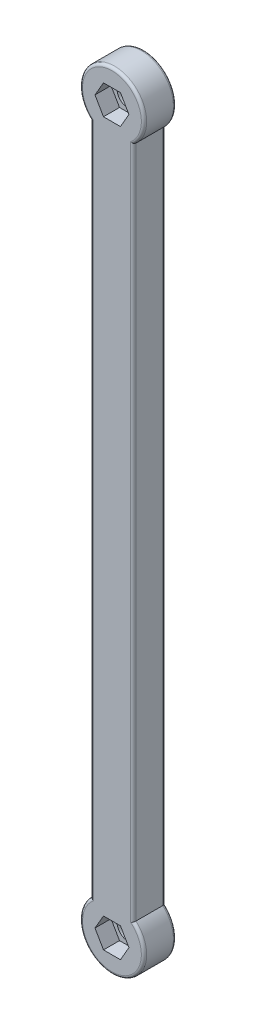
ISO-10303-21;
HEADER;
FILE_DESCRIPTION(('STEP AP214'),'2;1');
FILE_NAME('part.step','',(''),(''),'','','');
FILE_SCHEMA(('AUTOMOTIVE_DESIGN { 1 0 10303 214 1 1 1 1 }'));
ENDSEC;
DATA;
#1=APPLICATION_CONTEXT('core data for automotive mechanical design processes');
#2=APPLICATION_PROTOCOL_DEFINITION('international standard','automotive_design',2000,#1);
#3=PRODUCT_CONTEXT('',#1,'mechanical');
#4=PRODUCT('Part','Part','',(#3));
#5=PRODUCT_RELATED_PRODUCT_CATEGORY('part','',(#4));
#6=PRODUCT_DEFINITION_FORMATION('','',#4);
#7=PRODUCT_DEFINITION_CONTEXT('part definition',#1,'design');
#8=PRODUCT_DEFINITION('design','',#6,#7);
#9=PRODUCT_DEFINITION_SHAPE('','',#8);
#10=(LENGTH_UNIT() NAMED_UNIT(*) SI_UNIT(.MILLI.,.METRE.));
#11=(NAMED_UNIT(*) PLANE_ANGLE_UNIT() SI_UNIT($,.RADIAN.));
#12=(NAMED_UNIT(*) SI_UNIT($,.STERADIAN.) SOLID_ANGLE_UNIT());
#13=UNCERTAINTY_MEASURE_WITH_UNIT(LENGTH_MEASURE(1.E-05),#10,'distance_accuracy_value','');
#14=(GEOMETRIC_REPRESENTATION_CONTEXT(3) GLOBAL_UNCERTAINTY_ASSIGNED_CONTEXT((#13)) GLOBAL_UNIT_ASSIGNED_CONTEXT((#10,
#11,#12)) REPRESENTATION_CONTEXT('',''));
#15=CARTESIAN_POINT('',(0.,0.,0.));
#16=DIRECTION('',(0.,0.,1.));
#17=DIRECTION('',(1.,0.,0.));
#18=AXIS2_PLACEMENT_3D('',#15,#16,#17);
#19=CARTESIAN_POINT('',(0.,135.,3.));
#20=DIRECTION('',(0.,0.,-1.));
#21=DIRECTION('',(-1.,0.,0.));
#22=AXIS2_PLACEMENT_3D('',#19,#20,#21);
#23=CYLINDRICAL_SURFACE('',#22,2.05);
#24=CARTESIAN_POINT('',(0.,135.,-3.));
#25=DIRECTION('',(0.,0.,1.));
#26=DIRECTION('',(1.,0.,0.));
#27=AXIS2_PLACEMENT_3D('',#24,#25,#26);
#28=CIRCLE('',#27,2.05);
#29=CARTESIAN_POINT('',(2.05,135.,-3.));
#30=VERTEX_POINT('',#29);
#31=EDGE_CURVE('E339',#30,#30,#28,.T.);
#32=ORIENTED_EDGE('',*,*,#31,.F.);
#33=EDGE_LOOP('',(#32));
#34=FACE_BOUND('',#33,.T.);
#35=CARTESIAN_POINT('',(0.,135.,0.));
#36=DIRECTION('',(0.,0.,1.));
#37=DIRECTION('',(1.,0.,0.));
#38=AXIS2_PLACEMENT_3D('',#35,#36,#37);
#39=CIRCLE('',#38,2.05);
#40=CARTESIAN_POINT('',(2.05,135.,0.));
#41=VERTEX_POINT('',#40);
#42=EDGE_CURVE('E340',#41,#41,#39,.T.);
#43=ORIENTED_EDGE('',*,*,#42,.T.);
#44=EDGE_LOOP('',(#43));
#45=FACE_BOUND('',#44,.T.);
#46=ADVANCED_FACE('F45',(#34,#45),#23,.F.);
#47=CARTESIAN_POINT('',(0.,0.,3.));
#48=DIRECTION('',(0.,0.,-1.));
#49=DIRECTION('',(-1.,0.,0.));
#50=AXIS2_PLACEMENT_3D('',#47,#48,#49);
#51=CYLINDRICAL_SURFACE('',#50,2.05);
#52=CARTESIAN_POINT('',(0.,0.,-3.));
#53=DIRECTION('',(0.,0.,1.));
#54=DIRECTION('',(1.,0.,0.));
#55=AXIS2_PLACEMENT_3D('',#52,#53,#54);
#56=CIRCLE('',#55,2.05);
#57=CARTESIAN_POINT('',(2.05,0.,-3.));
#58=VERTEX_POINT('',#57);
#59=EDGE_CURVE('E335',#58,#58,#56,.T.);
#60=ORIENTED_EDGE('',*,*,#59,.F.);
#61=EDGE_LOOP('',(#60));
#62=FACE_BOUND('',#61,.T.);
#63=CARTESIAN_POINT('',(0.,0.,0.));
#64=DIRECTION('',(0.,0.,1.));
#65=DIRECTION('',(1.,0.,0.));
#66=AXIS2_PLACEMENT_3D('',#63,#64,#65);
#67=CIRCLE('',#66,2.05);
#68=CARTESIAN_POINT('',(2.05,0.,0.));
#69=VERTEX_POINT('',#68);
#70=EDGE_CURVE('E257',#69,#69,#67,.T.);
#71=ORIENTED_EDGE('',*,*,#70,.T.);
#72=EDGE_LOOP('',(#71));
#73=FACE_BOUND('',#72,.T.);
#74=ADVANCED_FACE('F535',(#62,#73),#51,.F.);
#75=CARTESIAN_POINT('',(-4.00000000000002,0.,3.));
#76=DIRECTION('',(1.,0.,0.));
#77=DIRECTION('',(0.,1.,0.));
#78=AXIS2_PLACEMENT_3D('',#75,#76,#77);
#79=PLANE('',#78);
#80=DIRECTION('',(0.,0.,-1.));
#81=VECTOR('',#80,1.);
#82=CARTESIAN_POINT('',(-4.00000000000001,4.47213595499957,3.));
#83=LINE('',#82,#81);
#84=CARTESIAN_POINT('',(-4.00000000000001,4.47213595499957,2.5));
#85=VERTEX_POINT('',#84);
#86=CARTESIAN_POINT('',(-4.00000000000001,4.47213595499957,-2.5));
#87=VERTEX_POINT('',#86);
#88=EDGE_CURVE('E354',#85,#87,#83,.T.);
#89=ORIENTED_EDGE('',*,*,#88,.F.);
#90=DIRECTION('',(0.,-1.,0.));
#91=VECTOR('',#90,1.);
#92=CARTESIAN_POINT('',(-4.,130.527864045,2.5));
#93=LINE('',#92,#91);
#94=CARTESIAN_POINT('',(-4.,130.527864045,2.5));
#95=VERTEX_POINT('',#94);
#96=EDGE_CURVE('E11',#85,#95,#93,.F.);
#97=ORIENTED_EDGE('',*,*,#96,.T.);
#98=DIRECTION('',(0.,0.,-1.));
#99=VECTOR('',#98,1.);
#100=CARTESIAN_POINT('',(-4.,130.527864045,3.));
#101=LINE('',#100,#99);
#102=CARTESIAN_POINT('',(-4.,130.527864045,-2.5));
#103=VERTEX_POINT('',#102);
#104=EDGE_CURVE('E344',#95,#103,#101,.T.);
#105=ORIENTED_EDGE('',*,*,#104,.T.);
#106=DIRECTION('',(0.,-1.,0.));
#107=VECTOR('',#106,1.);
#108=CARTESIAN_POINT('',(-4.00000000000002,0.,-2.5));
#109=LINE('',#108,#107);
#110=EDGE_CURVE('E60',#103,#87,#109,.T.);
#111=ORIENTED_EDGE('',*,*,#110,.T.);
#112=EDGE_LOOP('',(#89,#97,#105,#111));
#113=FACE_BOUND('',#112,.T.);
#114=ADVANCED_FACE('F519',(#113),#79,.F.);
#115=CARTESIAN_POINT('',(0.,0.,3.));
#116=DIRECTION('',(0.,0.,-1.));
#117=DIRECTION('',(-1.,0.,0.));
#118=AXIS2_PLACEMENT_3D('',#115,#116,#117);
#119=CYLINDRICAL_SURFACE('',#118,6.);
#120=DIRECTION('',(0.,0.,-1.));
#121=VECTOR('',#120,1.);
#122=CARTESIAN_POINT('',(4.00000000000001,4.47213595499957,3.));
#123=LINE('',#122,#121);
#124=CARTESIAN_POINT('',(4.00000000000001,4.47213595499957,2.5));
#125=VERTEX_POINT('',#124);
#126=CARTESIAN_POINT('',(4.00000000000001,4.47213595499957,-2.5));
#127=VERTEX_POINT('',#126);
#128=EDGE_CURVE('E351',#125,#127,#123,.T.);
#129=ORIENTED_EDGE('',*,*,#128,.F.);
#130=CARTESIAN_POINT('',(0.,0.,2.5));
#131=DIRECTION('',(0.,0.,1.));
#132=DIRECTION('',(1.,0.,0.));
#133=AXIS2_PLACEMENT_3D('',#130,#131,#132);
#134=CIRCLE('',#133,6.);
#135=EDGE_CURVE('E381',#125,#85,#134,.F.);
#136=ORIENTED_EDGE('',*,*,#135,.T.);
#137=ORIENTED_EDGE('',*,*,#88,.T.);
#138=CARTESIAN_POINT('',(0.,0.,-2.5));
#139=DIRECTION('',(0.,0.,1.));
#140=DIRECTION('',(1.,0.,0.));
#141=AXIS2_PLACEMENT_3D('',#138,#139,#140);
#142=CIRCLE('',#141,6.);
#143=EDGE_CURVE('E377',#87,#127,#142,.T.);
#144=ORIENTED_EDGE('',*,*,#143,.T.);
#145=EDGE_LOOP('',(#129,#136,#137,#144));
#146=FACE_BOUND('',#145,.T.);
#147=ADVANCED_FACE('F505',(#146),#119,.T.);
#148=CARTESIAN_POINT('',(4.00000000000002,0.,3.));
#149=DIRECTION('',(1.,0.,0.));
#150=DIRECTION('',(0.,1.,0.));
#151=AXIS2_PLACEMENT_3D('',#148,#149,#150);
#152=PLANE('',#151);
#153=ORIENTED_EDGE('',*,*,#128,.T.);
#154=DIRECTION('',(0.,-1.,0.));
#155=VECTOR('',#154,1.);
#156=CARTESIAN_POINT('',(4.,130.527864045,-2.5));
#157=LINE('',#156,#155);
#158=CARTESIAN_POINT('',(4.,130.527864045,-2.5));
#159=VERTEX_POINT('',#158);
#160=EDGE_CURVE('E68',#127,#159,#157,.F.);
#161=ORIENTED_EDGE('',*,*,#160,.T.);
#162=DIRECTION('',(0.,0.,-1.));
#163=VECTOR('',#162,1.);
#164=CARTESIAN_POINT('',(4.,130.527864045,3.));
#165=LINE('',#164,#163);
#166=CARTESIAN_POINT('',(4.,130.527864045,2.5));
#167=VERTEX_POINT('',#166);
#168=EDGE_CURVE('E348',#167,#159,#165,.T.);
#169=ORIENTED_EDGE('',*,*,#168,.F.);
#170=DIRECTION('',(0.,-1.,0.));
#171=VECTOR('',#170,1.);
#172=CARTESIAN_POINT('',(4.00000000000002,0.,2.5));
#173=LINE('',#172,#171);
#174=EDGE_CURVE('E403',#167,#125,#173,.T.);
#175=ORIENTED_EDGE('',*,*,#174,.T.);
#176=EDGE_LOOP('',(#153,#161,#169,#175));
#177=FACE_BOUND('',#176,.T.);
#178=ADVANCED_FACE('F508',(#177),#152,.T.);
#179=CARTESIAN_POINT('',(0.,135.,3.));
#180=DIRECTION('',(0.,0.,-1.));
#181=DIRECTION('',(-1.,0.,0.));
#182=AXIS2_PLACEMENT_3D('',#179,#180,#181);
#183=CYLINDRICAL_SURFACE('',#182,5.99999999999999);
#184=ORIENTED_EDGE('',*,*,#104,.F.);
#185=CARTESIAN_POINT('',(0.,135.,2.5));
#186=DIRECTION('',(0.,0.,1.));
#187=DIRECTION('',(1.,0.,0.));
#188=AXIS2_PLACEMENT_3D('',#185,#186,#187);
#189=CIRCLE('',#188,5.99999999999999);
#190=EDGE_CURVE('E75',#95,#167,#189,.F.);
#191=ORIENTED_EDGE('',*,*,#190,.T.);
#192=ORIENTED_EDGE('',*,*,#168,.T.);
#193=CARTESIAN_POINT('',(0.,135.,-2.5));
#194=DIRECTION('',(0.,0.,1.));
#195=DIRECTION('',(1.,0.,0.));
#196=AXIS2_PLACEMENT_3D('',#193,#194,#195);
#197=CIRCLE('',#196,5.99999999999999);
#198=EDGE_CURVE('E398',#159,#103,#197,.T.);
#199=ORIENTED_EDGE('',*,*,#198,.T.);
#200=EDGE_LOOP('',(#184,#191,#192,#199));
#201=FACE_BOUND('',#200,.T.);
#202=ADVANCED_FACE('F522',(#201),#183,.T.);
#203=CARTESIAN_POINT('',(0.,0.,3.));
#204=DIRECTION('',(0.,0.,1.));
#205=DIRECTION('',(1.,0.,0.));
#206=AXIS2_PLACEMENT_3D('',#203,#204,#205);
#207=PLANE('',#206);
#208=CARTESIAN_POINT('',(0.,0.,3.));
#209=DIRECTION('',(0.,0.,1.));
#210=DIRECTION('',(1.,0.,0.));
#211=AXIS2_PLACEMENT_3D('',#208,#209,#210);
#212=CIRCLE('',#211,5.5);
#213=CARTESIAN_POINT('',(-3.50000000000001,4.24264068711933,3.));
#214=VERTEX_POINT('',#213);
#215=CARTESIAN_POINT('',(3.49999999999995,4.24264068711933,3.));
#216=VERTEX_POINT('',#215);
#217=EDGE_CURVE('E370',#214,#216,#212,.T.);
#218=ORIENTED_EDGE('',*,*,#217,.T.);
#219=DIRECTION('',(0.,-1.,0.));
#220=VECTOR('',#219,1.);
#221=CARTESIAN_POINT('',(3.50000000000001,0.,3.));
#222=LINE('',#221,#220);
#223=CARTESIAN_POINT('',(3.49999999999993,130.757359312881,3.));
#224=VERTEX_POINT('',#223);
#225=EDGE_CURVE('E374',#216,#224,#222,.F.);
#226=ORIENTED_EDGE('',*,*,#225,.T.);
#227=CARTESIAN_POINT('',(0.,135.,3.));
#228=DIRECTION('',(0.,0.,1.));
#229=DIRECTION('',(1.,0.,0.));
#230=AXIS2_PLACEMENT_3D('',#227,#228,#229);
#231=CIRCLE('',#230,5.49999999999999);
#232=CARTESIAN_POINT('',(-3.5,130.757359312881,3.));
#233=VERTEX_POINT('',#232);
#234=EDGE_CURVE('E367',#224,#233,#231,.T.);
#235=ORIENTED_EDGE('',*,*,#234,.T.);
#236=DIRECTION('',(0.,-1.,0.));
#237=VECTOR('',#236,1.);
#238=CARTESIAN_POINT('',(-3.50000000000001,4.47213595499957,3.));
#239=LINE('',#238,#237);
#240=EDGE_CURVE('E358',#233,#214,#239,.T.);
#241=ORIENTED_EDGE('',*,*,#240,.T.);
#242=EDGE_LOOP('',(#218,#226,#235,#241));
#243=FACE_BOUND('',#242,.T.);
#244=DIRECTION('',(1.,0.,0.));
#245=VECTOR('',#244,1.);
#246=CARTESIAN_POINT('',(-1.58771324027147,-2.75,3.));
#247=LINE('',#246,#245);
#248=CARTESIAN_POINT('',(-1.58771324027147,-2.75,3.));
#249=VERTEX_POINT('',#248);
#250=CARTESIAN_POINT('',(1.58771324027147,-2.75,3.));
#251=VERTEX_POINT('',#250);
#252=EDGE_CURVE('E198',#249,#251,#247,.T.);
#253=ORIENTED_EDGE('',*,*,#252,.F.);
#254=DIRECTION('',(0.5,-0.866025403784439,0.));
#255=VECTOR('',#254,1.);
#256=CARTESIAN_POINT('',(-3.17542648054294,0.,3.));
#257=LINE('',#256,#255);
#258=CARTESIAN_POINT('',(-3.17542648054294,0.,3.));
#259=VERTEX_POINT('',#258);
#260=EDGE_CURVE('E219',#259,#249,#257,.T.);
#261=ORIENTED_EDGE('',*,*,#260,.F.);
#262=DIRECTION('',(-0.5,-0.866025403784438,0.));
#263=VECTOR('',#262,1.);
#264=CARTESIAN_POINT('',(-1.58771324027147,2.75,3.));
#265=LINE('',#264,#263);
#266=CARTESIAN_POINT('',(-1.58771324027147,2.75,3.));
#267=VERTEX_POINT('',#266);
#268=EDGE_CURVE('E223',#267,#259,#265,.T.);
#269=ORIENTED_EDGE('',*,*,#268,.F.);
#270=DIRECTION('',(-1.,0.,0.));
#271=VECTOR('',#270,1.);
#272=CARTESIAN_POINT('',(1.58771324027147,2.75,3.));
#273=LINE('',#272,#271);
#274=CARTESIAN_POINT('',(1.58771324027147,2.75,3.));
#275=VERTEX_POINT('',#274);
#276=EDGE_CURVE('E247',#275,#267,#273,.T.);
#277=ORIENTED_EDGE('',*,*,#276,.F.);
#278=DIRECTION('',(-0.5,0.866025403784438,0.));
#279=VECTOR('',#278,1.);
#280=CARTESIAN_POINT('',(3.17542648054294,0.,3.));
#281=LINE('',#280,#279);
#282=CARTESIAN_POINT('',(3.17542648054294,0.,3.));
#283=VERTEX_POINT('',#282);
#284=EDGE_CURVE('E243',#283,#275,#281,.T.);
#285=ORIENTED_EDGE('',*,*,#284,.F.);
#286=DIRECTION('',(0.5,0.866025403784439,0.));
#287=VECTOR('',#286,1.);
#288=CARTESIAN_POINT('',(1.58771324027147,-2.75,3.));
#289=LINE('',#288,#287);
#290=EDGE_CURVE('E239',#251,#283,#289,.T.);
#291=ORIENTED_EDGE('',*,*,#290,.F.);
#292=EDGE_LOOP('',(#253,#261,#269,#277,#285,#291));
#293=FACE_BOUND('',#292,.T.);
#294=DIRECTION('',(1.,0.,0.));
#295=VECTOR('',#294,1.);
#296=CARTESIAN_POINT('',(-1.58771324027151,132.25,3.));
#297=LINE('',#296,#295);
#298=CARTESIAN_POINT('',(-1.58771324027151,132.25,3.));
#299=VERTEX_POINT('',#298);
#300=CARTESIAN_POINT('',(1.58771324027147,132.25,3.));
#301=VERTEX_POINT('',#300);
#302=EDGE_CURVE('E240',#299,#301,#297,.T.);
#303=ORIENTED_EDGE('',*,*,#302,.F.);
#304=DIRECTION('',(0.500000000000001,-0.866025403784438,0.));
#305=VECTOR('',#304,1.);
#306=CARTESIAN_POINT('',(-3.17542648054297,135.,3.));
#307=LINE('',#306,#305);
#308=CARTESIAN_POINT('',(-3.17542648054297,135.,3.));
#309=VERTEX_POINT('',#308);
#310=EDGE_CURVE('E290',#309,#299,#307,.T.);
#311=ORIENTED_EDGE('',*,*,#310,.F.);
#312=DIRECTION('',(-0.499999999999999,-0.866025403784439,0.));
#313=VECTOR('',#312,1.);
#314=CARTESIAN_POINT('',(-1.58771324027152,137.75,3.));
#315=LINE('',#314,#313);
#316=CARTESIAN_POINT('',(-1.58771324027152,137.75,3.));
#317=VERTEX_POINT('',#316);
#318=EDGE_CURVE('E294',#317,#309,#315,.T.);
#319=ORIENTED_EDGE('',*,*,#318,.F.);
#320=DIRECTION('',(-1.,0.,0.));
#321=VECTOR('',#320,1.);
#322=CARTESIAN_POINT('',(1.58771324027148,137.75,3.));
#323=LINE('',#322,#321);
#324=CARTESIAN_POINT('',(1.58771324027148,137.75,3.));
#325=VERTEX_POINT('',#324);
#326=EDGE_CURVE('E299',#325,#317,#323,.T.);
#327=ORIENTED_EDGE('',*,*,#326,.F.);
#328=DIRECTION('',(-0.5,0.866025403784439,0.));
#329=VECTOR('',#328,1.);
#330=CARTESIAN_POINT('',(3.17542648054294,135.,3.));
#331=LINE('',#330,#329);
#332=CARTESIAN_POINT('',(3.17542648054294,135.,3.));
#333=VERTEX_POINT('',#332);
#334=EDGE_CURVE('E303',#333,#325,#331,.T.);
#335=ORIENTED_EDGE('',*,*,#334,.F.);
#336=DIRECTION('',(0.5,0.866025403784439,0.));
#337=VECTOR('',#336,1.);
#338=CARTESIAN_POINT('',(1.58771324027148,132.25,3.));
#339=LINE('',#338,#337);
#340=EDGE_CURVE('E307',#301,#333,#339,.T.);
#341=ORIENTED_EDGE('',*,*,#340,.F.);
#342=EDGE_LOOP('',(#303,#311,#319,#327,#335,#341));
#343=FACE_BOUND('',#342,.T.);
#344=ADVANCED_FACE('F524',(#243,#293,#343),#207,.T.);
#345=CARTESIAN_POINT('',(0.,0.,-3.));
#346=DIRECTION('',(0.,0.,1.));
#347=DIRECTION('',(1.,0.,0.));
#348=AXIS2_PLACEMENT_3D('',#345,#346,#347);
#349=PLANE('',#348);
#350=CARTESIAN_POINT('',(0.,135.,-3.));
#351=DIRECTION('',(0.,0.,1.));
#352=DIRECTION('',(1.,0.,0.));
#353=AXIS2_PLACEMENT_3D('',#350,#351,#352);
#354=CIRCLE('',#353,5.49999999999999);
#355=CARTESIAN_POINT('',(-3.5,130.757359312881,-3.));
#356=VERTEX_POINT('',#355);
#357=CARTESIAN_POINT('',(3.49999999999993,130.757359312881,-3.));
#358=VERTEX_POINT('',#357);
#359=EDGE_CURVE('E388',#356,#358,#354,.F.);
#360=ORIENTED_EDGE('',*,*,#359,.T.);
#361=DIRECTION('',(0.,-1.,0.));
#362=VECTOR('',#361,1.);
#363=CARTESIAN_POINT('',(3.50000000000001,4.47213595499957,-3.));
#364=LINE('',#363,#362);
#365=CARTESIAN_POINT('',(3.49999999999995,4.24264068711933,-3.));
#366=VERTEX_POINT('',#365);
#367=EDGE_CURVE('E395',#358,#366,#364,.T.);
#368=ORIENTED_EDGE('',*,*,#367,.T.);
#369=CARTESIAN_POINT('',(0.,0.,-3.));
#370=DIRECTION('',(0.,0.,1.));
#371=DIRECTION('',(1.,0.,0.));
#372=AXIS2_PLACEMENT_3D('',#369,#370,#371);
#373=CIRCLE('',#372,5.5);
#374=CARTESIAN_POINT('',(-3.50000000000001,4.24264068711933,-3.));
#375=VERTEX_POINT('',#374);
#376=EDGE_CURVE('E391',#366,#375,#373,.F.);
#377=ORIENTED_EDGE('',*,*,#376,.T.);
#378=DIRECTION('',(0.,-1.,0.));
#379=VECTOR('',#378,1.);
#380=CARTESIAN_POINT('',(-3.50000000000001,0.,-3.));
#381=LINE('',#380,#379);
#382=EDGE_CURVE('E385',#375,#356,#381,.F.);
#383=ORIENTED_EDGE('',*,*,#382,.T.);
#384=EDGE_LOOP('',(#360,#368,#377,#383));
#385=FACE_BOUND('',#384,.T.);
#386=ORIENTED_EDGE('',*,*,#59,.T.);
#387=EDGE_LOOP('',(#386));
#388=FACE_BOUND('',#387,.T.);
#389=ORIENTED_EDGE('',*,*,#31,.T.);
#390=EDGE_LOOP('',(#389));
#391=FACE_BOUND('',#390,.T.);
#392=ADVANCED_FACE('F501',(#385,#388,#391),#349,.F.);
#393=CARTESIAN_POINT('',(-1.58771324027151,132.25,0.));
#394=DIRECTION('',(0.,-1.,0.));
#395=DIRECTION('',(0.,0.,-1.));
#396=AXIS2_PLACEMENT_3D('',#393,#394,#395);
#397=PLANE('',#396);
#398=ORIENTED_EDGE('',*,*,#302,.T.);
#399=DIRECTION('',(0.,0.,1.));
#400=VECTOR('',#399,1.);
#401=CARTESIAN_POINT('',(1.58771324027148,132.25,0.));
#402=LINE('',#401,#400);
#403=CARTESIAN_POINT('',(1.58771324027148,132.25,0.));
#404=VERTEX_POINT('',#403);
#405=EDGE_CURVE('E269',#404,#301,#402,.T.);
#406=ORIENTED_EDGE('',*,*,#405,.F.);
#407=DIRECTION('',(1.,0.,0.));
#408=VECTOR('',#407,1.);
#409=CARTESIAN_POINT('',(-1.58771324027151,132.25,0.));
#410=LINE('',#409,#408);
#411=CARTESIAN_POINT('',(-1.58771324027151,132.25,0.));
#412=VERTEX_POINT('',#411);
#413=EDGE_CURVE('E295',#412,#404,#410,.T.);
#414=ORIENTED_EDGE('',*,*,#413,.F.);
#415=DIRECTION('',(0.,0.,1.));
#416=VECTOR('',#415,1.);
#417=CARTESIAN_POINT('',(-1.58771324027151,132.25,0.));
#418=LINE('',#417,#416);
#419=EDGE_CURVE('E286',#412,#299,#418,.T.);
#420=ORIENTED_EDGE('',*,*,#419,.T.);
#421=EDGE_LOOP('',(#398,#406,#414,#420));
#422=FACE_BOUND('',#421,.T.);
#423=ADVANCED_FACE('F578',(#422),#397,.F.);
#424=CARTESIAN_POINT('',(-3.17542648054297,135.,0.));
#425=DIRECTION('',(-0.866025403784438,-0.500000000000001,0.));
#426=DIRECTION('',(0.500000000000001,-0.866025403784438,0.));
#427=AXIS2_PLACEMENT_3D('',#424,#425,#426);
#428=PLANE('',#427);
#429=ORIENTED_EDGE('',*,*,#310,.T.);
#430=ORIENTED_EDGE('',*,*,#419,.F.);
#431=DIRECTION('',(0.500000000000001,-0.866025403784438,0.));
#432=VECTOR('',#431,1.);
#433=CARTESIAN_POINT('',(-3.17542648054297,135.,0.));
#434=LINE('',#433,#432);
#435=CARTESIAN_POINT('',(-3.17542648054297,135.,0.));
#436=VERTEX_POINT('',#435);
#437=EDGE_CURVE('E273',#436,#412,#434,.T.);
#438=ORIENTED_EDGE('',*,*,#437,.F.);
#439=DIRECTION('',(0.,0.,1.));
#440=VECTOR('',#439,1.);
#441=CARTESIAN_POINT('',(-3.17542648054297,135.,0.));
#442=LINE('',#441,#440);
#443=EDGE_CURVE('E283',#436,#309,#442,.T.);
#444=ORIENTED_EDGE('',*,*,#443,.T.);
#445=EDGE_LOOP('',(#429,#430,#438,#444));
#446=FACE_BOUND('',#445,.T.);
#447=ADVANCED_FACE('F765',(#446),#428,.F.);
#448=CARTESIAN_POINT('',(-1.58771324027152,137.75,0.));
#449=DIRECTION('',(-0.866025403784439,0.499999999999999,0.));
#450=DIRECTION('',(-0.499999999999999,-0.866025403784439,0.));
#451=AXIS2_PLACEMENT_3D('',#448,#449,#450);
#452=PLANE('',#451);
#453=ORIENTED_EDGE('',*,*,#318,.T.);
#454=ORIENTED_EDGE('',*,*,#443,.F.);
#455=DIRECTION('',(-0.499999999999999,-0.866025403784439,0.));
#456=VECTOR('',#455,1.);
#457=CARTESIAN_POINT('',(-1.58771324027152,137.75,0.));
#458=LINE('',#457,#456);
#459=CARTESIAN_POINT('',(-1.58771324027152,137.75,0.));
#460=VERTEX_POINT('',#459);
#461=EDGE_CURVE('E316',#460,#436,#458,.T.);
#462=ORIENTED_EDGE('',*,*,#461,.F.);
#463=DIRECTION('',(0.,0.,1.));
#464=VECTOR('',#463,1.);
#465=CARTESIAN_POINT('',(-1.58771324027152,137.75,0.));
#466=LINE('',#465,#464);
#467=EDGE_CURVE('E280',#460,#317,#466,.T.);
#468=ORIENTED_EDGE('',*,*,#467,.T.);
#469=EDGE_LOOP('',(#453,#454,#462,#468));
#470=FACE_BOUND('',#469,.T.);
#471=ADVANCED_FACE('F755',(#470),#452,.F.);
#472=CARTESIAN_POINT('',(1.58771324027148,137.75,0.));
#473=DIRECTION('',(0.,1.,0.));
#474=DIRECTION('',(0.,0.,1.));
#475=AXIS2_PLACEMENT_3D('',#472,#473,#474);
#476=PLANE('',#475);
#477=ORIENTED_EDGE('',*,*,#326,.T.);
#478=ORIENTED_EDGE('',*,*,#467,.F.);
#479=DIRECTION('',(-1.,0.,0.));
#480=VECTOR('',#479,1.);
#481=CARTESIAN_POINT('',(1.58771324027148,137.75,0.));
#482=LINE('',#481,#480);
#483=CARTESIAN_POINT('',(1.58771324027148,137.75,0.));
#484=VERTEX_POINT('',#483);
#485=EDGE_CURVE('E320',#484,#460,#482,.T.);
#486=ORIENTED_EDGE('',*,*,#485,.F.);
#487=DIRECTION('',(0.,0.,1.));
#488=VECTOR('',#487,1.);
#489=CARTESIAN_POINT('',(1.58771324027148,137.75,0.));
#490=LINE('',#489,#488);
#491=EDGE_CURVE('E277',#484,#325,#490,.T.);
#492=ORIENTED_EDGE('',*,*,#491,.T.);
#493=EDGE_LOOP('',(#477,#478,#486,#492));
#494=FACE_BOUND('',#493,.T.);
#495=ADVANCED_FACE('F745',(#494),#476,.F.);
#496=CARTESIAN_POINT('',(3.17542648054294,135.,0.));
#497=DIRECTION('',(0.866025403784439,0.5,0.));
#498=DIRECTION('',(-0.5,0.866025403784439,0.));
#499=AXIS2_PLACEMENT_3D('',#496,#497,#498);
#500=PLANE('',#499);
#501=ORIENTED_EDGE('',*,*,#334,.T.);
#502=ORIENTED_EDGE('',*,*,#491,.F.);
#503=DIRECTION('',(-0.5,0.866025403784439,0.));
#504=VECTOR('',#503,1.);
#505=CARTESIAN_POINT('',(3.17542648054294,135.,0.));
#506=LINE('',#505,#504);
#507=CARTESIAN_POINT('',(3.17542648054294,135.,0.));
#508=VERTEX_POINT('',#507);
#509=EDGE_CURVE('E324',#508,#484,#506,.T.);
#510=ORIENTED_EDGE('',*,*,#509,.F.);
#511=DIRECTION('',(0.,0.,1.));
#512=VECTOR('',#511,1.);
#513=CARTESIAN_POINT('',(3.17542648054294,135.,0.));
#514=LINE('',#513,#512);
#515=EDGE_CURVE('E274',#508,#333,#514,.T.);
#516=ORIENTED_EDGE('',*,*,#515,.T.);
#517=EDGE_LOOP('',(#501,#502,#510,#516));
#518=FACE_BOUND('',#517,.T.);
#519=ADVANCED_FACE('F735',(#518),#500,.F.);
#520=CARTESIAN_POINT('',(1.58771324027148,132.25,0.));
#521=DIRECTION('',(0.866025403784439,-0.5,0.));
#522=DIRECTION('',(0.5,0.866025403784439,0.));
#523=AXIS2_PLACEMENT_3D('',#520,#521,#522);
#524=PLANE('',#523);
#525=ORIENTED_EDGE('',*,*,#340,.T.);
#526=ORIENTED_EDGE('',*,*,#515,.F.);
#527=DIRECTION('',(0.5,0.866025403784439,0.));
#528=VECTOR('',#527,1.);
#529=CARTESIAN_POINT('',(1.58771324027148,132.25,0.));
#530=LINE('',#529,#528);
#531=EDGE_CURVE('E328',#404,#508,#530,.T.);
#532=ORIENTED_EDGE('',*,*,#531,.F.);
#533=ORIENTED_EDGE('',*,*,#405,.T.);
#534=EDGE_LOOP('',(#525,#526,#532,#533));
#535=FACE_BOUND('',#534,.T.);
#536=ADVANCED_FACE('F725',(#535),#524,.F.);
#537=CARTESIAN_POINT('',(0.,0.,0.));
#538=DIRECTION('',(0.,0.,1.));
#539=DIRECTION('',(1.,0.,0.));
#540=AXIS2_PLACEMENT_3D('',#537,#538,#539);
#541=PLANE('',#540);
#542=ORIENTED_EDGE('',*,*,#42,.F.);
#543=EDGE_LOOP('',(#542));
#544=FACE_BOUND('',#543,.T.);
#545=ORIENTED_EDGE('',*,*,#413,.T.);
#546=ORIENTED_EDGE('',*,*,#531,.T.);
#547=ORIENTED_EDGE('',*,*,#509,.T.);
#548=ORIENTED_EDGE('',*,*,#485,.T.);
#549=ORIENTED_EDGE('',*,*,#461,.T.);
#550=ORIENTED_EDGE('',*,*,#437,.T.);
#551=EDGE_LOOP('',(#545,#546,#547,#548,#549,#550));
#552=FACE_BOUND('',#551,.T.);
#553=ADVANCED_FACE('F716',(#544,#552),#541,.T.);
#554=CARTESIAN_POINT('',(-1.58771324027147,-2.75,0.));
#555=DIRECTION('',(0.,-1.,0.));
#556=DIRECTION('',(1.,0.,0.));
#557=AXIS2_PLACEMENT_3D('',#554,#555,#556);
#558=PLANE('',#557);
#559=ORIENTED_EDGE('',*,*,#252,.T.);
#560=DIRECTION('',(0.,0.,1.));
#561=VECTOR('',#560,1.);
#562=CARTESIAN_POINT('',(1.58771324027147,-2.75,0.));
#563=LINE('',#562,#561);
#564=CARTESIAN_POINT('',(1.58771324027147,-2.75,0.));
#565=VERTEX_POINT('',#564);
#566=EDGE_CURVE('E191',#565,#251,#563,.T.);
#567=ORIENTED_EDGE('',*,*,#566,.F.);
#568=DIRECTION('',(1.,0.,0.));
#569=VECTOR('',#568,1.);
#570=CARTESIAN_POINT('',(-1.58771324027147,-2.75,0.));
#571=LINE('',#570,#569);
#572=CARTESIAN_POINT('',(-1.58771324027147,-2.75,0.));
#573=VERTEX_POINT('',#572);
#574=EDGE_CURVE('E195',#573,#565,#571,.T.);
#575=ORIENTED_EDGE('',*,*,#574,.F.);
#576=DIRECTION('',(0.,0.,1.));
#577=VECTOR('',#576,1.);
#578=CARTESIAN_POINT('',(-1.58771324027147,-2.75,0.));
#579=LINE('',#578,#577);
#580=EDGE_CURVE('E254',#573,#249,#579,.T.);
#581=ORIENTED_EDGE('',*,*,#580,.T.);
#582=EDGE_LOOP('',(#559,#567,#575,#581));
#583=FACE_BOUND('',#582,.T.);
#584=ADVANCED_FACE('F193',(#583),#558,.F.);
#585=CARTESIAN_POINT('',(-3.17542648054294,0.,0.));
#586=DIRECTION('',(-0.866025403784439,-0.5,0.));
#587=DIRECTION('',(0.5,-0.866025403784439,0.));
#588=AXIS2_PLACEMENT_3D('',#585,#586,#587);
#589=PLANE('',#588);
#590=ORIENTED_EDGE('',*,*,#260,.T.);
#591=ORIENTED_EDGE('',*,*,#580,.F.);
#592=DIRECTION('',(0.5,-0.866025403784439,0.));
#593=VECTOR('',#592,1.);
#594=CARTESIAN_POINT('',(-3.17542648054294,0.,0.));
#595=LINE('',#594,#593);
#596=CARTESIAN_POINT('',(-3.17542648054294,0.,0.));
#597=VERTEX_POINT('',#596);
#598=EDGE_CURVE('E204',#597,#573,#595,.T.);
#599=ORIENTED_EDGE('',*,*,#598,.F.);
#600=DIRECTION('',(0.,0.,1.));
#601=VECTOR('',#600,1.);
#602=CARTESIAN_POINT('',(-3.17542648054294,0.,0.));
#603=LINE('',#602,#601);
#604=EDGE_CURVE('E258',#597,#259,#603,.T.);
#605=ORIENTED_EDGE('',*,*,#604,.T.);
#606=EDGE_LOOP('',(#590,#591,#599,#605));
#607=FACE_BOUND('',#606,.T.);
#608=ADVANCED_FACE('F697',(#607),#589,.F.);
#609=CARTESIAN_POINT('',(-1.58771324027147,2.75,0.));
#610=DIRECTION('',(-0.866025403784439,0.5,0.));
#611=DIRECTION('',(-0.5,-0.866025403784439,0.));
#612=AXIS2_PLACEMENT_3D('',#609,#610,#611);
#613=PLANE('',#612);
#614=ORIENTED_EDGE('',*,*,#268,.T.);
#615=ORIENTED_EDGE('',*,*,#604,.F.);
#616=DIRECTION('',(-0.5,-0.866025403784438,0.));
#617=VECTOR('',#616,1.);
#618=CARTESIAN_POINT('',(-1.58771324027147,2.75,0.));
#619=LINE('',#618,#617);
#620=CARTESIAN_POINT('',(-1.58771324027147,2.75,0.));
#621=VERTEX_POINT('',#620);
#622=EDGE_CURVE('E232',#621,#597,#619,.T.);
#623=ORIENTED_EDGE('',*,*,#622,.F.);
#624=DIRECTION('',(0.,0.,1.));
#625=VECTOR('',#624,1.);
#626=CARTESIAN_POINT('',(-1.58771324027147,2.75,0.));
#627=LINE('',#626,#625);
#628=EDGE_CURVE('E261',#621,#267,#627,.T.);
#629=ORIENTED_EDGE('',*,*,#628,.T.);
#630=EDGE_LOOP('',(#614,#615,#623,#629));
#631=FACE_BOUND('',#630,.T.);
#632=ADVANCED_FACE('F687',(#631),#613,.F.);
#633=CARTESIAN_POINT('',(1.58771324027147,2.75,0.));
#634=DIRECTION('',(0.,1.,0.));
#635=DIRECTION('',(-1.,0.,0.));
#636=AXIS2_PLACEMENT_3D('',#633,#634,#635);
#637=PLANE('',#636);
#638=ORIENTED_EDGE('',*,*,#276,.T.);
#639=ORIENTED_EDGE('',*,*,#628,.F.);
#640=DIRECTION('',(-1.,0.,0.));
#641=VECTOR('',#640,1.);
#642=CARTESIAN_POINT('',(1.58771324027147,2.75,0.));
#643=LINE('',#642,#641);
#644=CARTESIAN_POINT('',(1.58771324027147,2.75,0.));
#645=VERTEX_POINT('',#644);
#646=EDGE_CURVE('E228',#645,#621,#643,.T.);
#647=ORIENTED_EDGE('',*,*,#646,.F.);
#648=DIRECTION('',(0.,0.,1.));
#649=VECTOR('',#648,1.);
#650=CARTESIAN_POINT('',(1.58771324027147,2.75,0.));
#651=LINE('',#650,#649);
#652=EDGE_CURVE('E264',#645,#275,#651,.T.);
#653=ORIENTED_EDGE('',*,*,#652,.T.);
#654=EDGE_LOOP('',(#638,#639,#647,#653));
#655=FACE_BOUND('',#654,.T.);
#656=ADVANCED_FACE('F677',(#655),#637,.F.);
#657=CARTESIAN_POINT('',(3.17542648054294,0.,0.));
#658=DIRECTION('',(0.866025403784438,0.5,0.));
#659=DIRECTION('',(-0.5,0.866025403784438,0.));
#660=AXIS2_PLACEMENT_3D('',#657,#658,#659);
#661=PLANE('',#660);
#662=ORIENTED_EDGE('',*,*,#284,.T.);
#663=ORIENTED_EDGE('',*,*,#652,.F.);
#664=DIRECTION('',(-0.5,0.866025403784438,0.));
#665=VECTOR('',#664,1.);
#666=CARTESIAN_POINT('',(3.17542648054294,0.,0.));
#667=LINE('',#666,#665);
#668=CARTESIAN_POINT('',(3.17542648054294,0.,0.));
#669=VERTEX_POINT('',#668);
#670=EDGE_CURVE('E213',#669,#645,#667,.T.);
#671=ORIENTED_EDGE('',*,*,#670,.F.);
#672=DIRECTION('',(0.,0.,1.));
#673=VECTOR('',#672,1.);
#674=CARTESIAN_POINT('',(3.17542648054294,0.,0.));
#675=LINE('',#674,#673);
#676=EDGE_CURVE('E203',#669,#283,#675,.T.);
#677=ORIENTED_EDGE('',*,*,#676,.T.);
#678=EDGE_LOOP('',(#662,#663,#671,#677));
#679=FACE_BOUND('',#678,.T.);
#680=ADVANCED_FACE('F668',(#679),#661,.F.);
#681=CARTESIAN_POINT('',(1.58771324027147,-2.75,0.));
#682=DIRECTION('',(0.866025403784439,-0.5,0.));
#683=DIRECTION('',(0.5,0.866025403784439,0.));
#684=AXIS2_PLACEMENT_3D('',#681,#682,#683);
#685=PLANE('',#684);
#686=ORIENTED_EDGE('',*,*,#290,.T.);
#687=ORIENTED_EDGE('',*,*,#676,.F.);
#688=DIRECTION('',(0.5,0.866025403784439,0.));
#689=VECTOR('',#688,1.);
#690=CARTESIAN_POINT('',(1.58771324027147,-2.75,0.));
#691=LINE('',#690,#689);
#692=EDGE_CURVE('E207',#565,#669,#691,.T.);
#693=ORIENTED_EDGE('',*,*,#692,.F.);
#694=ORIENTED_EDGE('',*,*,#566,.T.);
#695=EDGE_LOOP('',(#686,#687,#693,#694));
#696=FACE_BOUND('',#695,.T.);
#697=ADVANCED_FACE('F208',(#696),#685,.F.);
#698=CARTESIAN_POINT('',(0.,0.,0.));
#699=DIRECTION('',(0.,0.,1.));
#700=DIRECTION('',(1.,0.,0.));
#701=AXIS2_PLACEMENT_3D('',#698,#699,#700);
#702=PLANE('',#701);
#703=ORIENTED_EDGE('',*,*,#70,.F.);
#704=EDGE_LOOP('',(#703));
#705=FACE_BOUND('',#704,.T.);
#706=ORIENTED_EDGE('',*,*,#574,.T.);
#707=ORIENTED_EDGE('',*,*,#692,.T.);
#708=ORIENTED_EDGE('',*,*,#670,.T.);
#709=ORIENTED_EDGE('',*,*,#646,.T.);
#710=ORIENTED_EDGE('',*,*,#622,.T.);
#711=ORIENTED_EDGE('',*,*,#598,.T.);
#712=EDGE_LOOP('',(#706,#707,#708,#709,#710,#711));
#713=FACE_BOUND('',#712,.T.);
#714=ADVANCED_FACE('F215',(#705,#713),#702,.T.);
#715=CARTESIAN_POINT('',(0.,135.,2.5));
#716=DIRECTION('',(0.,0.,1.));
#717=DIRECTION('',(1.,0.,0.));
#718=AXIS2_PLACEMENT_3D('',#715,#716,#717);
#719=TOROIDAL_SURFACE('',#718,5.49999999999999,0.5);
#720=CARTESIAN_POINT('',(4.,130.527864045,2.5));
#721=CARTESIAN_POINT('',(4.00003067217501,130.527851451065,2.52634859921386));
#722=CARTESIAN_POINT('',(3.99791939120107,130.528794528728,2.55267646341803));
#723=CARTESIAN_POINT('',(3.98965437043085,130.532492470937,2.60447990203365));
#724=CARTESIAN_POINT('',(3.98351293246132,130.535241821967,2.62995782294056));
#725=CARTESIAN_POINT('',(3.96742922730983,130.542452574728,2.6794109005822));
#726=CARTESIAN_POINT('',(3.95748828798874,130.546913378338,2.70338657892168));
#727=CARTESIAN_POINT('',(3.93420232514667,130.557384012566,2.74925881256873));
#728=CARTESIAN_POINT('',(3.92085580566158,130.563394523935,2.77115444836378));
#729=CARTESIAN_POINT('',(3.89071817115704,130.577000978456,2.81309588504605));
#730=CARTESIAN_POINT('',(3.87382461685688,130.584644226762,2.83305248759867));
#731=CARTESIAN_POINT('',(3.83745277752135,130.601150241537,2.86985893538035));
#732=CARTESIAN_POINT('',(3.81797369901185,130.610013382411,2.88670782307124));
#733=CARTESIAN_POINT('',(3.7752921543032,130.629499907478,2.91830152707239));
#734=CARTESIAN_POINT('',(3.7519150476461,130.640208210663,2.93275769056251));
#735=CARTESIAN_POINT('',(3.7034470553127,130.66249928974,2.95754863623554));
#736=CARTESIAN_POINT('',(3.67835528291861,130.67408251842,2.96788126680327));
#737=CARTESIAN_POINT('',(3.62864196675569,130.697129705738,2.98383045664892));
#738=CARTESIAN_POINT('',(3.60408208642937,130.708559347654,2.98969216123756));
#739=CARTESIAN_POINT('',(3.55453775530872,130.731711758549,2.99764757325372));
#740=CARTESIAN_POINT('',(3.52955424227002,130.743433901794,2.99974872423052));
#741=CARTESIAN_POINT('',(3.50307050770168,130.755912045433,2.99999294384793));
#742=CARTESIAN_POINT('',(3.50153515544852,130.756635632089,3.00000001560537));
#743=CARTESIAN_POINT('',(3.5,130.757359312881,3.));
#744=B_SPLINE_CURVE_WITH_KNOTS('',3,(#720,#721,#722,#723,#724,#725,#726,#727,#728,#729,#730,
#731,#732,#733,#734,#735,#736,#737,#738,#739,#740,#741,#742,#743),.UNSPECIFIED.,.F.,.F.,(4,2,2,
2,2,2,2,2,2,2,2,4),(0.,0.0789122788113536,0.157584795832475,0.236229843255581,0.314909496622119,
0.396287603903118,0.477690743386182,0.565816126651258,0.653987432860698,0.73688421634395,
0.819616733697776,0.824708658579268),.UNSPECIFIED.);
#745=EDGE_CURVE('E451',#167,#224,#744,.T.);
#746=ORIENTED_EDGE('',*,*,#745,.F.);
#747=ORIENTED_EDGE('',*,*,#190,.F.);
#748=CARTESIAN_POINT('',(-4.,130.527864045,2.5));
#749=CARTESIAN_POINT('',(-4.00003067217501,130.527851451065,2.52634859921386));
#750=CARTESIAN_POINT('',(-3.99791939120107,130.528794528728,2.55267646341803));
#751=CARTESIAN_POINT('',(-3.98965437043085,130.532492470937,2.60447990203365));
#752=CARTESIAN_POINT('',(-3.98351293246132,130.535241821967,2.62995782294056));
#753=CARTESIAN_POINT('',(-3.96742922730983,130.542452574728,2.6794109005822));
#754=CARTESIAN_POINT('',(-3.95748828798874,130.546913378338,2.70338657892168));
#755=CARTESIAN_POINT('',(-3.93420232514667,130.557384012566,2.74925881256873));
#756=CARTESIAN_POINT('',(-3.92085580566158,130.563394523935,2.77115444836378));
#757=CARTESIAN_POINT('',(-3.89071817115704,130.577000978456,2.81309588504605));
#758=CARTESIAN_POINT('',(-3.87382461685688,130.584644226762,2.83305248759867));
#759=CARTESIAN_POINT('',(-3.83745277752135,130.601150241537,2.86985893538035));
#760=CARTESIAN_POINT('',(-3.81797369901185,130.610013382411,2.88670782307124));
#761=CARTESIAN_POINT('',(-3.7752921543032,130.629499907478,2.91830152707239));
#762=CARTESIAN_POINT('',(-3.7519150476461,130.640208210663,2.93275769056251));
#763=CARTESIAN_POINT('',(-3.7034470553127,130.66249928974,2.95754863623554));
#764=CARTESIAN_POINT('',(-3.67835528291861,130.67408251842,2.96788126680327));
#765=CARTESIAN_POINT('',(-3.62864196675569,130.697129705738,2.98383045664892));
#766=CARTESIAN_POINT('',(-3.60408208642937,130.708559347654,2.98969216123756));
#767=CARTESIAN_POINT('',(-3.55453775530872,130.731711758549,2.99764757325372));
#768=CARTESIAN_POINT('',(-3.52955424227002,130.743433901794,2.99974872423052));
#769=CARTESIAN_POINT('',(-3.50307050770168,130.755912045433,2.99999294384793));
#770=CARTESIAN_POINT('',(-3.50153515544852,130.756635632089,3.00000001560537));
#771=CARTESIAN_POINT('',(-3.5,130.757359312881,3.));
#772=B_SPLINE_CURVE_WITH_KNOTS('',3,(#748,#749,#750,#751,#752,#753,#754,#755,#756,#757,#758,
#759,#760,#761,#762,#763,#764,#765,#766,#767,#768,#769,#770,#771),.UNSPECIFIED.,.F.,.F.,(4,2,2,
2,2,2,2,2,2,2,2,4),(0.,0.0789122788113536,0.157584795832475,0.236229843255581,0.314909496622119,
0.396287603903118,0.477690743386182,0.565816126651258,0.653987432860698,0.73688421634395,
0.819616733697776,0.824708658579268),.UNSPECIFIED.);
#773=EDGE_CURVE('E289',#233,#95,#772,.F.);
#774=ORIENTED_EDGE('',*,*,#773,.F.);
#775=ORIENTED_EDGE('',*,*,#234,.F.);
#776=EDGE_LOOP('',(#746,#747,#774,#775));
#777=FACE_BOUND('',#776,.T.);
#778=ADVANCED_FACE('F438',(#777),#719,.T.);
#779=CARTESIAN_POINT('',(-3.50000000000001,0.,2.5));
#780=DIRECTION('',(0.,1.,0.));
#781=DIRECTION('',(-1.,0.,0.));
#782=AXIS2_PLACEMENT_3D('',#779,#780,#781);
#783=CYLINDRICAL_SURFACE('',#782,0.5);
#784=ORIENTED_EDGE('',*,*,#773,.T.);
#785=ORIENTED_EDGE('',*,*,#96,.F.);
#786=CARTESIAN_POINT('',(-4.00000000000001,4.47213595499957,2.5));
#787=CARTESIAN_POINT('',(-4.00003067217502,4.47214854893459,2.52634859921386));
#788=CARTESIAN_POINT('',(-3.99791939120108,4.47120547127247,2.55267646341803));
#789=CARTESIAN_POINT('',(-3.98965437043087,4.46750752906262,2.60447990203365));
#790=CARTESIAN_POINT('',(-3.98351293246133,4.46475817803299,2.62995782294056));
#791=CARTESIAN_POINT('',(-3.96742922730985,4.45754742527199,2.6794109005822));
#792=CARTESIAN_POINT('',(-3.95748828798875,4.453086621662,2.70338657892168));
#793=CARTESIAN_POINT('',(-3.93420232514669,4.44261598743352,2.74925881256873));
#794=CARTESIAN_POINT('',(-3.92085580566159,4.43660547606505,2.77115444836378));
#795=CARTESIAN_POINT('',(-3.89071817115705,4.42299902154415,2.81309588504605));
#796=CARTESIAN_POINT('',(-3.8738246168569,4.41535577323781,2.83305248759868));
#797=CARTESIAN_POINT('',(-3.83745277752136,4.39884975846283,2.86985893538035));
#798=CARTESIAN_POINT('',(-3.81797369901187,4.38998661758917,2.88670782307124));
#799=CARTESIAN_POINT('',(-3.77529215430321,4.37050009252154,2.91830152707238));
#800=CARTESIAN_POINT('',(-3.75191504764612,4.359791789337,2.93275769056251));
#801=CARTESIAN_POINT('',(-3.70344705531271,4.33750071026031,2.95754863623554));
#802=CARTESIAN_POINT('',(-3.67835528291862,4.32591748158033,2.96788126680327));
#803=CARTESIAN_POINT('',(-3.6286419667557,4.30287029426223,2.98383045664892));
#804=CARTESIAN_POINT('',(-3.60408208642939,4.29144065234568,2.98969216123756));
#805=CARTESIAN_POINT('',(-3.55453775530875,4.26828824145108,2.99764757325372));
#806=CARTESIAN_POINT('',(-3.52955424227004,4.25656609820612,2.99974872423052));
#807=CARTESIAN_POINT('',(-3.5030705077017,4.24408795456706,2.99999294384793));
#808=CARTESIAN_POINT('',(-3.50153515544853,4.24336436791096,3.00000001560537));
#809=CARTESIAN_POINT('',(-3.50000000000001,4.24264068711927,3.));
#810=B_SPLINE_CURVE_WITH_KNOTS('',3,(#786,#787,#788,#789,#790,#791,#792,#793,#794,#795,#796,
#797,#798,#799,#800,#801,#802,#803,#804,#805,#806,#807,#808,#809),.UNSPECIFIED.,.F.,.F.,(4,2,2,
2,2,2,2,2,2,2,2,4),(0.,0.0789122788113548,0.157584795832474,0.236229843255584,0.314909496622121,
0.396287603903116,0.47769074338618,0.565816126651262,0.653987432860702,0.736884216343939,
0.819616733697774,0.824708658579267),.UNSPECIFIED.);
#811=EDGE_CURVE('E419',#214,#85,#810,.F.);
#812=ORIENTED_EDGE('',*,*,#811,.F.);
#813=ORIENTED_EDGE('',*,*,#240,.F.);
#814=EDGE_LOOP('',(#784,#785,#812,#813));
#815=FACE_BOUND('',#814,.T.);
#816=ADVANCED_FACE('F433',(#815),#783,.T.);
#817=CARTESIAN_POINT('',(3.50000000000001,0.,2.5));
#818=DIRECTION('',(0.,-1.,0.));
#819=DIRECTION('',(1.,0.,0.));
#820=AXIS2_PLACEMENT_3D('',#817,#818,#819);
#821=CYLINDRICAL_SURFACE('',#820,0.5);
#822=ORIENTED_EDGE('',*,*,#745,.T.);
#823=ORIENTED_EDGE('',*,*,#225,.F.);
#824=CARTESIAN_POINT('',(4.00000000000001,4.47213595499957,2.5));
#825=CARTESIAN_POINT('',(4.00003067217502,4.47214854893459,2.52634859921386));
#826=CARTESIAN_POINT('',(3.99791939120108,4.47120547127247,2.55267646341803));
#827=CARTESIAN_POINT('',(3.98965437043087,4.46750752906262,2.60447990203365));
#828=CARTESIAN_POINT('',(3.98351293246133,4.46475817803299,2.62995782294056));
#829=CARTESIAN_POINT('',(3.96742922730985,4.45754742527199,2.6794109005822));
#830=CARTESIAN_POINT('',(3.95748828798875,4.453086621662,2.70338657892168));
#831=CARTESIAN_POINT('',(3.93420232514669,4.44261598743352,2.74925881256873));
#832=CARTESIAN_POINT('',(3.92085580566159,4.43660547606505,2.77115444836378));
#833=CARTESIAN_POINT('',(3.89071817115705,4.42299902154415,2.81309588504605));
#834=CARTESIAN_POINT('',(3.8738246168569,4.41535577323781,2.83305248759868));
#835=CARTESIAN_POINT('',(3.83745277752136,4.39884975846283,2.86985893538035));
#836=CARTESIAN_POINT('',(3.81797369901187,4.38998661758917,2.88670782307124));
#837=CARTESIAN_POINT('',(3.77529215430321,4.37050009252154,2.91830152707238));
#838=CARTESIAN_POINT('',(3.75191504764612,4.359791789337,2.93275769056251));
#839=CARTESIAN_POINT('',(3.70344705531271,4.33750071026031,2.95754863623554));
#840=CARTESIAN_POINT('',(3.67835528291862,4.32591748158033,2.96788126680327));
#841=CARTESIAN_POINT('',(3.6286419667557,4.30287029426223,2.98383045664892));
#842=CARTESIAN_POINT('',(3.60408208642939,4.29144065234568,2.98969216123756));
#843=CARTESIAN_POINT('',(3.55453775530875,4.26828824145108,2.99764757325372));
#844=CARTESIAN_POINT('',(3.52955424227004,4.25656609820612,2.99974872423052));
#845=CARTESIAN_POINT('',(3.5030705077017,4.24408795456706,2.99999294384793));
#846=CARTESIAN_POINT('',(3.50153515544853,4.24336436791096,3.00000001560537));
#847=CARTESIAN_POINT('',(3.50000000000001,4.24264068711927,3.));
#848=B_SPLINE_CURVE_WITH_KNOTS('',3,(#824,#825,#826,#827,#828,#829,#830,#831,#832,#833,#834,
#835,#836,#837,#838,#839,#840,#841,#842,#843,#844,#845,#846,#847),.UNSPECIFIED.,.F.,.F.,(4,2,2,
2,2,2,2,2,2,2,2,4),(0.,0.0789122788113548,0.157584795832474,0.236229843255584,0.314909496622121,
0.396287603903116,0.47769074338618,0.565816126651262,0.653987432860702,0.736884216343939,
0.819616733697774,0.824708658579267),.UNSPECIFIED.);
#849=EDGE_CURVE('E410',#125,#216,#848,.T.);
#850=ORIENTED_EDGE('',*,*,#849,.F.);
#851=ORIENTED_EDGE('',*,*,#174,.F.);
#852=EDGE_LOOP('',(#822,#823,#850,#851));
#853=FACE_BOUND('',#852,.T.);
#854=ADVANCED_FACE('F426',(#853),#821,.T.);
#855=CARTESIAN_POINT('',(0.,0.,2.5));
#856=DIRECTION('',(0.,0.,1.));
#857=DIRECTION('',(1.,0.,0.));
#858=AXIS2_PLACEMENT_3D('',#855,#856,#857);
#859=TOROIDAL_SURFACE('',#858,5.5,0.5);
#860=ORIENTED_EDGE('',*,*,#811,.T.);
#861=ORIENTED_EDGE('',*,*,#135,.F.);
#862=ORIENTED_EDGE('',*,*,#849,.T.);
#863=ORIENTED_EDGE('',*,*,#217,.F.);
#864=EDGE_LOOP('',(#860,#861,#862,#863));
#865=FACE_BOUND('',#864,.T.);
#866=ADVANCED_FACE('F429',(#865),#859,.T.);
#867=CARTESIAN_POINT('',(0.,135.,-2.5));
#868=DIRECTION('',(0.,0.,1.));
#869=DIRECTION('',(1.,0.,0.));
#870=AXIS2_PLACEMENT_3D('',#867,#868,#869);
#871=TOROIDAL_SURFACE('',#870,5.49999999999999,0.5);
#872=CARTESIAN_POINT('',(4.,130.527864045,-2.5));
#873=CARTESIAN_POINT('',(4.00003067217501,130.527851451065,-2.52634859921386));
#874=CARTESIAN_POINT('',(3.99791939120107,130.528794528728,-2.55267646341803));
#875=CARTESIAN_POINT('',(3.98965437043085,130.532492470937,-2.60447990203365));
#876=CARTESIAN_POINT('',(3.98351293246132,130.535241821967,-2.62995782294056));
#877=CARTESIAN_POINT('',(3.96742922730983,130.542452574728,-2.67941090058219));
#878=CARTESIAN_POINT('',(3.95748828798874,130.546913378338,-2.70338657892168));
#879=CARTESIAN_POINT('',(3.93420232514667,130.557384012566,-2.74925881256872));
#880=CARTESIAN_POINT('',(3.92085580566158,130.563394523935,-2.77115444836378));
#881=CARTESIAN_POINT('',(3.89071817115704,130.577000978456,-2.81309588504604));
#882=CARTESIAN_POINT('',(3.87382461685689,130.584644226762,-2.83305248759867));
#883=CARTESIAN_POINT('',(3.83745277752135,130.601150241537,-2.86985893538035));
#884=CARTESIAN_POINT('',(3.81797369901186,130.610013382411,-2.88670782307124));
#885=CARTESIAN_POINT('',(3.7752921543032,130.629499907478,-2.91830152707238));
#886=CARTESIAN_POINT('',(3.7519150476461,130.640208210663,-2.93275769056251));
#887=CARTESIAN_POINT('',(3.7034470553127,130.66249928974,-2.95754863623554));
#888=CARTESIAN_POINT('',(3.67835528291862,130.67408251842,-2.96788126680327));
#889=CARTESIAN_POINT('',(3.62864196675568,130.697129705738,-2.98383045664892));
#890=CARTESIAN_POINT('',(3.60408208642934,130.708559347654,-2.98969216123756));
#891=CARTESIAN_POINT('',(3.55453775530876,130.731711758549,-2.99764757325372));
#892=CARTESIAN_POINT('',(3.52955424227014,130.743433901794,-2.99974872423052));
#893=CARTESIAN_POINT('',(3.50307050770169,130.755912045433,-2.99999294384793));
#894=CARTESIAN_POINT('',(3.50153515544852,130.756635632089,-3.00000001560537));
#895=CARTESIAN_POINT('',(3.5,130.757359312881,-3.));
#896=B_SPLINE_CURVE_WITH_KNOTS('',3,(#872,#873,#874,#875,#876,#877,#878,#879,#880,#881,#882,
#883,#884,#885,#886,#887,#888,#889,#890,#891,#892,#893,#894,#895),.UNSPECIFIED.,.F.,.F.,(4,2,2,
2,2,2,2,2,2,2,2,4),(0.,0.0789122788113526,0.157584795832475,0.236229843255576,0.314909496622118,
0.396287603903112,0.477690743386181,0.565816126651255,0.653987432860697,0.736884216343938,
0.819616733697793,0.824708658579268),.UNSPECIFIED.);
#897=EDGE_CURVE('E478',#358,#159,#896,.F.);
#898=ORIENTED_EDGE('',*,*,#897,.F.);
#899=ORIENTED_EDGE('',*,*,#359,.F.);
#900=CARTESIAN_POINT('',(-4.,130.527864045,-2.5));
#901=CARTESIAN_POINT('',(-4.00003067217501,130.527851451065,-2.52634859921386));
#902=CARTESIAN_POINT('',(-3.99791939120107,130.528794528728,-2.55267646341803));
#903=CARTESIAN_POINT('',(-3.98965437043085,130.532492470937,-2.60447990203365));
#904=CARTESIAN_POINT('',(-3.98351293246132,130.535241821967,-2.62995782294056));
#905=CARTESIAN_POINT('',(-3.96742922730983,130.542452574728,-2.67941090058219));
#906=CARTESIAN_POINT('',(-3.95748828798874,130.546913378338,-2.70338657892168));
#907=CARTESIAN_POINT('',(-3.93420232514667,130.557384012567,-2.74925881256872));
#908=CARTESIAN_POINT('',(-3.92085580566158,130.563394523935,-2.77115444836378));
#909=CARTESIAN_POINT('',(-3.89071817115704,130.577000978456,-2.81309588504605));
#910=CARTESIAN_POINT('',(-3.87382461685688,130.584644226762,-2.83305248759867));
#911=CARTESIAN_POINT('',(-3.83745277752135,130.601150241537,-2.86985893538035));
#912=CARTESIAN_POINT('',(-3.81797369901186,130.610013382411,-2.88670782307124));
#913=CARTESIAN_POINT('',(-3.7752921543032,130.629499907478,-2.91830152707238));
#914=CARTESIAN_POINT('',(-3.7519150476461,130.640208210663,-2.93275769056251));
#915=CARTESIAN_POINT('',(-3.7034470553127,130.66249928974,-2.95754863623554));
#916=CARTESIAN_POINT('',(-3.67835528291861,130.67408251842,-2.96788126680327));
#917=CARTESIAN_POINT('',(-3.62864196675569,130.697129705738,-2.98383045664892));
#918=CARTESIAN_POINT('',(-3.60408208642937,130.708559347654,-2.98969216123756));
#919=CARTESIAN_POINT('',(-3.55453775530872,130.731711758549,-2.99764757325372));
#920=CARTESIAN_POINT('',(-3.52955424227001,130.743433901794,-2.99974872423052));
#921=CARTESIAN_POINT('',(-3.50307050770168,130.755912045433,-2.99999294384793));
#922=CARTESIAN_POINT('',(-3.50153515544852,130.756635632089,-3.00000001560537));
#923=CARTESIAN_POINT('',(-3.5,130.757359312881,-3.));
#924=B_SPLINE_CURVE_WITH_KNOTS('',3,(#900,#901,#902,#903,#904,#905,#906,#907,#908,#909,#910,
#911,#912,#913,#914,#915,#916,#917,#918,#919,#920,#921,#922,#923),.UNSPECIFIED.,.F.,.F.,(4,2,2,
2,2,2,2,2,2,2,2,4),(0.,0.0789122788113531,0.157584795832475,0.236229843255585,0.314909496622117,
0.396287603903116,0.477690743386179,0.565816126651256,0.653987432860696,0.73688421634395,
0.819616733697777,0.824708658579267),.UNSPECIFIED.);
#925=EDGE_CURVE('E50',#103,#356,#924,.T.);
#926=ORIENTED_EDGE('',*,*,#925,.F.);
#927=ORIENTED_EDGE('',*,*,#198,.F.);
#928=EDGE_LOOP('',(#898,#899,#926,#927));
#929=FACE_BOUND('',#928,.T.);
#930=ADVANCED_FACE('F47',(#929),#871,.T.);
#931=CARTESIAN_POINT('',(-3.50000000000001,0.,-2.5));
#932=DIRECTION('',(0.,-1.,0.));
#933=DIRECTION('',(1.,0.,0.));
#934=AXIS2_PLACEMENT_3D('',#931,#932,#933);
#935=CYLINDRICAL_SURFACE('',#934,0.5);
#936=ORIENTED_EDGE('',*,*,#925,.T.);
#937=ORIENTED_EDGE('',*,*,#382,.F.);
#938=CARTESIAN_POINT('',(-4.00000000000001,4.47213595499957,-2.5));
#939=CARTESIAN_POINT('',(-4.00003067217502,4.47214854893459,-2.52634859921386));
#940=CARTESIAN_POINT('',(-3.99791939120109,4.47120547127247,-2.55267646341803));
#941=CARTESIAN_POINT('',(-3.98965437043087,4.46750752906262,-2.60447990203365));
#942=CARTESIAN_POINT('',(-3.98351293246133,4.46475817803299,-2.62995782294056));
#943=CARTESIAN_POINT('',(-3.96742922730985,4.45754742527199,-2.6794109005822));
#944=CARTESIAN_POINT('',(-3.95748828798875,4.453086621662,-2.70338657892168));
#945=CARTESIAN_POINT('',(-3.93420232514669,4.44261598743352,-2.74925881256872));
#946=CARTESIAN_POINT('',(-3.92085580566159,4.43660547606505,-2.77115444836378));
#947=CARTESIAN_POINT('',(-3.89071817115705,4.42299902154415,-2.81309588504605));
#948=CARTESIAN_POINT('',(-3.8738246168569,4.41535577323781,-2.83305248759867));
#949=CARTESIAN_POINT('',(-3.83745277752136,4.39884975846283,-2.86985893538035));
#950=CARTESIAN_POINT('',(-3.81797369901187,4.38998661758917,-2.88670782307124));
#951=CARTESIAN_POINT('',(-3.77529215430321,4.37050009252154,-2.91830152707238));
#952=CARTESIAN_POINT('',(-3.75191504764612,4.359791789337,-2.93275769056251));
#953=CARTESIAN_POINT('',(-3.70344705531271,4.33750071026031,-2.95754863623554));
#954=CARTESIAN_POINT('',(-3.67835528291863,4.32591748158032,-2.96788126680327));
#955=CARTESIAN_POINT('',(-3.6286419667557,4.30287029426223,-2.98383045664892));
#956=CARTESIAN_POINT('',(-3.60408208642938,4.29144065234568,-2.98969216123756));
#957=CARTESIAN_POINT('',(-3.55453775530875,4.26828824145108,-2.99764757325372));
#958=CARTESIAN_POINT('',(-3.52955424227005,4.25656609820609,-2.99974872423052));
#959=CARTESIAN_POINT('',(-3.5030705077017,4.24408795456706,-2.99999294384793));
#960=CARTESIAN_POINT('',(-3.50153515544853,4.24336436791096,-3.00000001560537));
#961=CARTESIAN_POINT('',(-3.50000000000001,4.24264068711927,-3.));
#962=B_SPLINE_CURVE_WITH_KNOTS('',3,(#938,#939,#940,#941,#942,#943,#944,#945,#946,#947,#948,
#949,#950,#951,#952,#953,#954,#955,#956,#957,#958,#959,#960,#961),.UNSPECIFIED.,.F.,.F.,(4,2,2,
2,2,2,2,2,2,2,2,4),(0.,0.0789122788113552,0.157584795832474,0.236229843255583,0.314909496622119,
0.396287603903116,0.47769074338618,0.565816126651262,0.653987432860701,0.736884216343939,
0.819616733697774,0.824708658579267),.UNSPECIFIED.);
#963=EDGE_CURVE('E464',#87,#375,#962,.T.);
#964=ORIENTED_EDGE('',*,*,#963,.F.);
#965=ORIENTED_EDGE('',*,*,#110,.F.);
#966=EDGE_LOOP('',(#936,#937,#964,#965));
#967=FACE_BOUND('',#966,.T.);
#968=ADVANCED_FACE('F474',(#967),#935,.T.);
#969=CARTESIAN_POINT('',(3.50000000000001,0.,-2.5));
#970=DIRECTION('',(0.,1.,0.));
#971=DIRECTION('',(-1.,0.,0.));
#972=AXIS2_PLACEMENT_3D('',#969,#970,#971);
#973=CYLINDRICAL_SURFACE('',#972,0.5);
#974=ORIENTED_EDGE('',*,*,#897,.T.);
#975=ORIENTED_EDGE('',*,*,#160,.F.);
#976=CARTESIAN_POINT('',(4.00000000000001,4.47213595499957,-2.5));
#977=CARTESIAN_POINT('',(4.00003067217502,4.47214854893459,-2.52634859921386));
#978=CARTESIAN_POINT('',(3.99791939120109,4.47120547127247,-2.55267646341803));
#979=CARTESIAN_POINT('',(3.98965437043087,4.46750752906262,-2.60447990203365));
#980=CARTESIAN_POINT('',(3.98351293246133,4.46475817803299,-2.62995782294056));
#981=CARTESIAN_POINT('',(3.96742922730985,4.45754742527199,-2.6794109005822));
#982=CARTESIAN_POINT('',(3.95748828798875,4.453086621662,-2.70338657892168));
#983=CARTESIAN_POINT('',(3.93420232514669,4.44261598743352,-2.74925881256872));
#984=CARTESIAN_POINT('',(3.92085580566159,4.43660547606505,-2.77115444836378));
#985=CARTESIAN_POINT('',(3.89071817115705,4.42299902154415,-2.81309588504605));
#986=CARTESIAN_POINT('',(3.8738246168569,4.41535577323781,-2.83305248759867));
#987=CARTESIAN_POINT('',(3.83745277752136,4.39884975846283,-2.86985893538035));
#988=CARTESIAN_POINT('',(3.81797369901187,4.38998661758917,-2.88670782307124));
#989=CARTESIAN_POINT('',(3.77529215430321,4.37050009252155,-2.91830152707238));
#990=CARTESIAN_POINT('',(3.75191504764612,4.359791789337,-2.93275769056251));
#991=CARTESIAN_POINT('',(3.70344705531272,4.33750071026031,-2.95754863623554));
#992=CARTESIAN_POINT('',(3.67835528291864,4.3259174815803,-2.96788126680327));
#993=CARTESIAN_POINT('',(3.62864196675569,4.30287029426224,-2.98383045664892));
#994=CARTESIAN_POINT('',(3.60408208642935,4.29144065234575,-2.98969216123756));
#995=CARTESIAN_POINT('',(3.55453775530878,4.26828824145101,-2.99764757325372));
#996=CARTESIAN_POINT('',(3.52955424227016,4.25656609820585,-2.99974872423052));
#997=CARTESIAN_POINT('',(3.50307050770171,4.24408795456703,-2.99999294384793));
#998=CARTESIAN_POINT('',(3.50153515544854,4.24336436791094,-3.00000001560537));
#999=CARTESIAN_POINT('',(3.50000000000001,4.24264068711927,-3.));
#1000=B_SPLINE_CURVE_WITH_KNOTS('',3,(#976,#977,#978,#979,#980,#981,#982,#983,#984,#985,#986,
#987,#988,#989,#990,#991,#992,#993,#994,#995,#996,#997,#998,#999),.UNSPECIFIED.,.F.,.F.,(4,2,2,
2,2,2,2,2,2,2,2,4),(0.,0.0789122788113548,0.157584795832474,0.236229843255583,0.314909496622119,
0.396287603903115,0.47769074338618,0.565816126651261,0.653987432860701,0.736884216343938,
0.819616733697774,0.824708658579267),.UNSPECIFIED.);
#1001=EDGE_CURVE('E456',#366,#127,#1000,.F.);
#1002=ORIENTED_EDGE('',*,*,#1001,.F.);
#1003=ORIENTED_EDGE('',*,*,#367,.F.);
#1004=EDGE_LOOP('',(#974,#975,#1002,#1003));
#1005=FACE_BOUND('',#1004,.T.);
#1006=ADVANCED_FACE('F471',(#1005),#973,.T.);
#1007=CARTESIAN_POINT('',(0.,0.,-2.5));
#1008=DIRECTION('',(0.,0.,1.));
#1009=DIRECTION('',(1.,0.,0.));
#1010=AXIS2_PLACEMENT_3D('',#1007,#1008,#1009);
#1011=TOROIDAL_SURFACE('',#1010,5.5,0.5);
#1012=ORIENTED_EDGE('',*,*,#963,.T.);
#1013=ORIENTED_EDGE('',*,*,#376,.F.);
#1014=ORIENTED_EDGE('',*,*,#1001,.T.);
#1015=ORIENTED_EDGE('',*,*,#143,.F.);
#1016=EDGE_LOOP('',(#1012,#1013,#1014,#1015));
#1017=FACE_BOUND('',#1016,.T.);
#1018=ADVANCED_FACE('F469',(#1017),#1011,.T.);
#1019=CLOSED_SHELL('',(#46,#74,#114,#147,#178,#202,#344,#392,#423,#447,#471,#495,#519,#536,#553,
#584,#608,#632,#656,#680,#697,#714,#778,#816,#854,#866,#930,#968,#1006,#1018));
#1020=MANIFOLD_SOLID_BREP('B2',#1019);
#1021=ADVANCED_BREP_SHAPE_REPRESENTATION('',(#18,#1020),#14);
#1022=SHAPE_DEFINITION_REPRESENTATION(#9,#1021);
ENDSEC;
END-ISO-10303-21;
